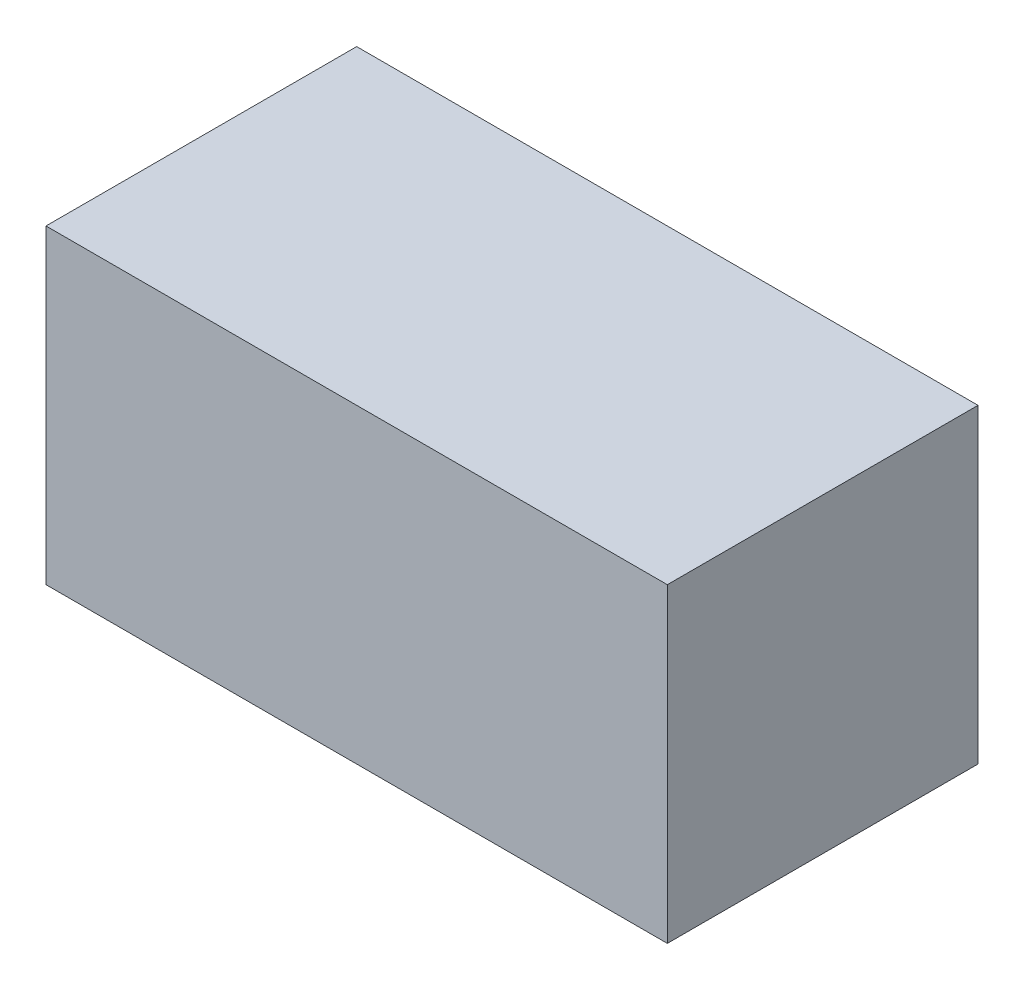
ISO-10303-21;
HEADER;
FILE_DESCRIPTION(('STEP AP214'),'2;1');
FILE_NAME('part.step','',(''),(''),'','','');
FILE_SCHEMA(('AUTOMOTIVE_DESIGN { 1 0 10303 214 1 1 1 1 }'));
ENDSEC;
DATA;
#1=APPLICATION_CONTEXT('core data for automotive mechanical design processes');
#2=APPLICATION_PROTOCOL_DEFINITION('international standard','automotive_design',2000,#1);
#3=PRODUCT_CONTEXT('',#1,'mechanical');
#4=PRODUCT('Part','Part','',(#3));
#5=PRODUCT_RELATED_PRODUCT_CATEGORY('part','',(#4));
#6=PRODUCT_DEFINITION_FORMATION('','',#4);
#7=PRODUCT_DEFINITION_CONTEXT('part definition',#1,'design');
#8=PRODUCT_DEFINITION('design','',#6,#7);
#9=PRODUCT_DEFINITION_SHAPE('','',#8);
#10=(LENGTH_UNIT() NAMED_UNIT(*) SI_UNIT(.MILLI.,.METRE.));
#11=(NAMED_UNIT(*) PLANE_ANGLE_UNIT() SI_UNIT($,.RADIAN.));
#12=(NAMED_UNIT(*) SI_UNIT($,.STERADIAN.) SOLID_ANGLE_UNIT());
#13=UNCERTAINTY_MEASURE_WITH_UNIT(LENGTH_MEASURE(1.E-05),#10,'distance_accuracy_value','');
#14=(GEOMETRIC_REPRESENTATION_CONTEXT(3) GLOBAL_UNCERTAINTY_ASSIGNED_CONTEXT((#13)) GLOBAL_UNIT_ASSIGNED_CONTEXT((#10,
#11,#12)) REPRESENTATION_CONTEXT('',''));
#15=CARTESIAN_POINT('',(0.,0.,0.));
#16=DIRECTION('',(0.,0.,1.));
#17=DIRECTION('',(1.,0.,0.));
#18=AXIS2_PLACEMENT_3D('',#15,#16,#17);
#19=CARTESIAN_POINT('',(4.,-2.,2.));
#20=DIRECTION('',(0.,0.,1.));
#21=DIRECTION('',(1.,0.,0.));
#22=AXIS2_PLACEMENT_3D('',#19,#20,#21);
#23=PLANE('',#22);
#24=DIRECTION('',(0.,1.,0.));
#25=VECTOR('',#24,1.);
#26=CARTESIAN_POINT('',(-4.,-2.,2.));
#27=LINE('',#26,#25);
#28=CARTESIAN_POINT('',(-4.,-2.,2.));
#29=VERTEX_POINT('',#28);
#30=CARTESIAN_POINT('',(-4.,2.,2.));
#31=VERTEX_POINT('',#30);
#32=EDGE_CURVE('E100',#29,#31,#27,.T.);
#33=ORIENTED_EDGE('',*,*,#32,.F.);
#34=DIRECTION('',(-1.,0.,0.));
#35=VECTOR('',#34,1.);
#36=CARTESIAN_POINT('',(4.,-2.,2.));
#37=LINE('',#36,#35);
#38=CARTESIAN_POINT('',(4.,-2.,2.));
#39=VERTEX_POINT('',#38);
#40=EDGE_CURVE('E11',#39,#29,#37,.T.);
#41=ORIENTED_EDGE('',*,*,#40,.F.);
#42=DIRECTION('',(0.,1.,0.));
#43=VECTOR('',#42,1.);
#44=CARTESIAN_POINT('',(4.,-2.,2.));
#45=LINE('',#44,#43);
#46=CARTESIAN_POINT('',(4.,2.,2.));
#47=VERTEX_POINT('',#46);
#48=EDGE_CURVE('E95',#39,#47,#45,.T.);
#49=ORIENTED_EDGE('',*,*,#48,.T.);
#50=DIRECTION('',(-1.,0.,0.));
#51=VECTOR('',#50,1.);
#52=CARTESIAN_POINT('',(4.,2.,2.));
#53=LINE('',#52,#51);
#54=EDGE_CURVE('E38',#47,#31,#53,.T.);
#55=ORIENTED_EDGE('',*,*,#54,.T.);
#56=EDGE_LOOP('',(#33,#41,#49,#55));
#57=FACE_BOUND('',#56,.T.);
#58=ADVANCED_FACE('F35',(#57),#23,.T.);
#59=CARTESIAN_POINT('',(4.,-2.,2.));
#60=DIRECTION('',(0.,1.,0.));
#61=DIRECTION('',(0.,0.,1.));
#62=AXIS2_PLACEMENT_3D('',#59,#60,#61);
#63=PLANE('',#62);
#64=DIRECTION('',(0.,0.,-1.));
#65=VECTOR('',#64,1.);
#66=CARTESIAN_POINT('',(-4.,-2.,2.));
#67=LINE('',#66,#65);
#68=CARTESIAN_POINT('',(-4.,-2.,-2.));
#69=VERTEX_POINT('',#68);
#70=EDGE_CURVE('E68',#29,#69,#67,.T.);
#71=ORIENTED_EDGE('',*,*,#70,.T.);
#72=DIRECTION('',(-1.,0.,0.));
#73=VECTOR('',#72,1.);
#74=CARTESIAN_POINT('',(4.,-2.,-2.));
#75=LINE('',#74,#73);
#76=CARTESIAN_POINT('',(4.,-2.,-2.));
#77=VERTEX_POINT('',#76);
#78=EDGE_CURVE('E44',#77,#69,#75,.T.);
#79=ORIENTED_EDGE('',*,*,#78,.F.);
#80=DIRECTION('',(0.,0.,-1.));
#81=VECTOR('',#80,1.);
#82=CARTESIAN_POINT('',(4.,-2.,2.));
#83=LINE('',#82,#81);
#84=EDGE_CURVE('E85',#39,#77,#83,.T.);
#85=ORIENTED_EDGE('',*,*,#84,.F.);
#86=ORIENTED_EDGE('',*,*,#40,.T.);
#87=EDGE_LOOP('',(#71,#79,#85,#86));
#88=FACE_BOUND('',#87,.T.);
#89=ADVANCED_FACE('F110',(#88),#63,.F.);
#90=CARTESIAN_POINT('',(4.,-2.,-2.));
#91=DIRECTION('',(0.,0.,1.));
#92=DIRECTION('',(0.,-1.,0.));
#93=AXIS2_PLACEMENT_3D('',#90,#91,#92);
#94=PLANE('',#93);
#95=DIRECTION('',(0.,1.,0.));
#96=VECTOR('',#95,1.);
#97=CARTESIAN_POINT('',(-4.,-2.,-2.));
#98=LINE('',#97,#96);
#99=CARTESIAN_POINT('',(-4.,2.,-2.));
#100=VERTEX_POINT('',#99);
#101=EDGE_CURVE('E92',#69,#100,#98,.T.);
#102=ORIENTED_EDGE('',*,*,#101,.T.);
#103=DIRECTION('',(-1.,0.,0.));
#104=VECTOR('',#103,1.);
#105=CARTESIAN_POINT('',(4.,2.,-2.));
#106=LINE('',#105,#104);
#107=CARTESIAN_POINT('',(4.,2.,-2.));
#108=VERTEX_POINT('',#107);
#109=EDGE_CURVE('E89',#108,#100,#106,.T.);
#110=ORIENTED_EDGE('',*,*,#109,.F.);
#111=DIRECTION('',(0.,1.,0.));
#112=VECTOR('',#111,1.);
#113=CARTESIAN_POINT('',(4.,-2.,-2.));
#114=LINE('',#113,#112);
#115=EDGE_CURVE('E80',#77,#108,#114,.T.);
#116=ORIENTED_EDGE('',*,*,#115,.F.);
#117=ORIENTED_EDGE('',*,*,#78,.T.);
#118=EDGE_LOOP('',(#102,#110,#116,#117));
#119=FACE_BOUND('',#118,.T.);
#120=ADVANCED_FACE('F90',(#119),#94,.F.);
#121=CARTESIAN_POINT('',(4.,2.,2.));
#122=DIRECTION('',(0.,1.,0.));
#123=DIRECTION('',(0.,0.,1.));
#124=AXIS2_PLACEMENT_3D('',#121,#122,#123);
#125=PLANE('',#124);
#126=DIRECTION('',(0.,0.,-1.));
#127=VECTOR('',#126,1.);
#128=CARTESIAN_POINT('',(-4.,2.,2.));
#129=LINE('',#128,#127);
#130=EDGE_CURVE('E103',#31,#100,#129,.T.);
#131=ORIENTED_EDGE('',*,*,#130,.F.);
#132=ORIENTED_EDGE('',*,*,#54,.F.);
#133=DIRECTION('',(0.,0.,-1.));
#134=VECTOR('',#133,1.);
#135=CARTESIAN_POINT('',(4.,2.,2.));
#136=LINE('',#135,#134);
#137=EDGE_CURVE('E84',#47,#108,#136,.T.);
#138=ORIENTED_EDGE('',*,*,#137,.T.);
#139=ORIENTED_EDGE('',*,*,#109,.T.);
#140=EDGE_LOOP('',(#131,#132,#138,#139));
#141=FACE_BOUND('',#140,.T.);
#142=ADVANCED_FACE('F94',(#141),#125,.T.);
#143=CARTESIAN_POINT('',(4.,0.,0.));
#144=DIRECTION('',(-1.,0.,0.));
#145=DIRECTION('',(0.,0.,1.));
#146=AXIS2_PLACEMENT_3D('',#143,#144,#145);
#147=PLANE('',#146);
#148=ORIENTED_EDGE('',*,*,#48,.F.);
#149=ORIENTED_EDGE('',*,*,#84,.T.);
#150=ORIENTED_EDGE('',*,*,#115,.T.);
#151=ORIENTED_EDGE('',*,*,#137,.F.);
#152=EDGE_LOOP('',(#148,#149,#150,#151));
#153=FACE_BOUND('',#152,.T.);
#154=ADVANCED_FACE('F83',(#153),#147,.F.);
#155=CARTESIAN_POINT('',(-4.,0.,0.));
#156=DIRECTION('',(-1.,0.,0.));
#157=DIRECTION('',(0.,0.,1.));
#158=AXIS2_PLACEMENT_3D('',#155,#156,#157);
#159=PLANE('',#158);
#160=ORIENTED_EDGE('',*,*,#32,.T.);
#161=ORIENTED_EDGE('',*,*,#130,.T.);
#162=ORIENTED_EDGE('',*,*,#101,.F.);
#163=ORIENTED_EDGE('',*,*,#70,.F.);
#164=EDGE_LOOP('',(#160,#161,#162,#163));
#165=FACE_BOUND('',#164,.T.);
#166=ADVANCED_FACE('F108',(#165),#159,.T.);
#167=CLOSED_SHELL('',(#58,#89,#120,#142,#154,#166));
#168=MANIFOLD_SOLID_BREP('B2',#167);
#169=ADVANCED_BREP_SHAPE_REPRESENTATION('',(#18,#168),#14);
#170=SHAPE_DEFINITION_REPRESENTATION(#9,#169);
ENDSEC;
END-ISO-10303-21;
